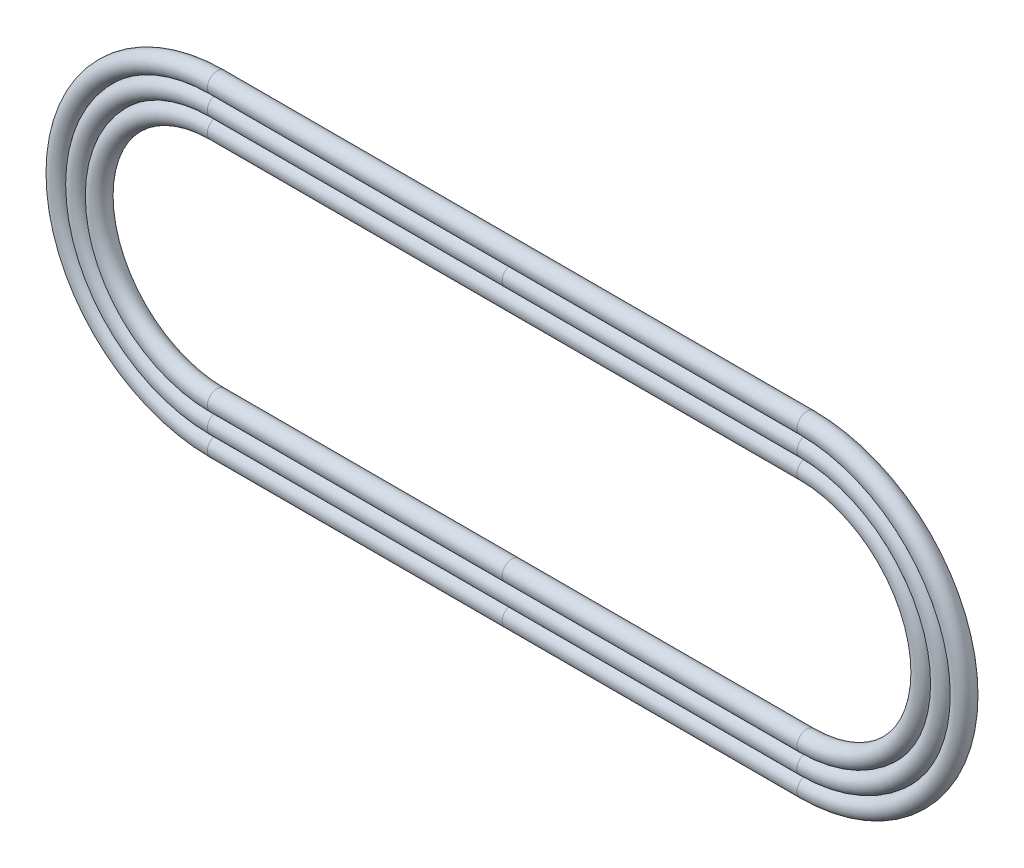
ISO-10303-21;
HEADER;
FILE_DESCRIPTION(('STEP AP214'),'2;1');
FILE_NAME('part.step','',(''),(''),'','','');
FILE_SCHEMA(('AUTOMOTIVE_DESIGN { 1 0 10303 214 1 1 1 1 }'));
ENDSEC;
DATA;
#1=APPLICATION_CONTEXT('core data for automotive mechanical design processes');
#2=APPLICATION_PROTOCOL_DEFINITION('international standard','automotive_design',2000,#1);
#3=PRODUCT_CONTEXT('',#1,'mechanical');
#4=PRODUCT('Part','Part','',(#3));
#5=PRODUCT_RELATED_PRODUCT_CATEGORY('part','',(#4));
#6=PRODUCT_DEFINITION_FORMATION('','',#4);
#7=PRODUCT_DEFINITION_CONTEXT('part definition',#1,'design');
#8=PRODUCT_DEFINITION('design','',#6,#7);
#9=PRODUCT_DEFINITION_SHAPE('','',#8);
#10=(LENGTH_UNIT() NAMED_UNIT(*) SI_UNIT(.MILLI.,.METRE.));
#11=(NAMED_UNIT(*) PLANE_ANGLE_UNIT() SI_UNIT($,.RADIAN.));
#12=(NAMED_UNIT(*) SI_UNIT($,.STERADIAN.) SOLID_ANGLE_UNIT());
#13=UNCERTAINTY_MEASURE_WITH_UNIT(LENGTH_MEASURE(1.E-05),#10,'distance_accuracy_value','');
#14=(GEOMETRIC_REPRESENTATION_CONTEXT(3) GLOBAL_UNCERTAINTY_ASSIGNED_CONTEXT((#13)) GLOBAL_UNIT_ASSIGNED_CONTEXT((#10,
#11,#12)) REPRESENTATION_CONTEXT('',''));
#15=CARTESIAN_POINT('',(0.,0.,0.));
#16=DIRECTION('',(0.,0.,1.));
#17=DIRECTION('',(1.,0.,0.));
#18=AXIS2_PLACEMENT_3D('',#15,#16,#17);
#19=CARTESIAN_POINT('',(0.,-600.,0.));
#20=DIRECTION('',(-1.,0.,0.));
#21=DIRECTION('',(0.,-1.,0.));
#22=AXIS2_PLACEMENT_3D('',#19,#20,#21);
#23=CYLINDRICAL_SURFACE('',#22,50.);
#24=CARTESIAN_POINT('',(-1500.,-600.,0.));
#25=DIRECTION('',(1.,0.,0.));
#26=DIRECTION('',(0.,0.,-1.));
#27=AXIS2_PLACEMENT_3D('',#24,#25,#26);
#28=CIRCLE('',#27,50.);
#29=CARTESIAN_POINT('',(-1500.,-650.,0.));
#30=VERTEX_POINT('',#29);
#31=EDGE_CURVE('E65',#30,#30,#28,.T.);
#32=ORIENTED_EDGE('',*,*,#31,.T.);
#33=EDGE_LOOP('',(#32));
#34=FACE_BOUND('',#33,.T.);
#35=CARTESIAN_POINT('',(0.,-600.,0.));
#36=DIRECTION('',(1.,0.,0.));
#37=DIRECTION('',(0.,0.,-1.));
#38=AXIS2_PLACEMENT_3D('',#35,#36,#37);
#39=CIRCLE('',#38,50.);
#40=CARTESIAN_POINT('',(0.,-600.,-50.));
#41=VERTEX_POINT('',#40);
#42=EDGE_CURVE('E70',#41,#41,#39,.T.);
#43=ORIENTED_EDGE('',*,*,#42,.F.);
#44=EDGE_LOOP('',(#43));
#45=FACE_BOUND('',#44,.T.);
#46=ADVANCED_FACE('F50',(#34,#45),#23,.T.);
#47=CARTESIAN_POINT('',(-1500.,0.,0.));
#48=DIRECTION('',(0.,0.,-1.));
#49=DIRECTION('',(-1.,0.,0.));
#50=AXIS2_PLACEMENT_3D('',#47,#48,#49);
#51=TOROIDAL_SURFACE('',#50,600.,50.);
#52=CARTESIAN_POINT('',(-1500.,600.,0.));
#53=DIRECTION('',(-1.,0.,0.));
#54=DIRECTION('',(0.,0.,-1.));
#55=AXIS2_PLACEMENT_3D('',#52,#53,#54);
#56=CIRCLE('',#55,50.);
#57=CARTESIAN_POINT('',(-1500.,650.,0.));
#58=VERTEX_POINT('',#57);
#59=EDGE_CURVE('E61',#58,#58,#56,.T.);
#60=CARTESIAN_POINT('',(-1500.,0.,0.));
#61=DIRECTION('',(0.,0.,-1.));
#62=DIRECTION('',(-1.,0.,0.));
#63=AXIS2_PLACEMENT_3D('',#60,#61,#62);
#64=CIRCLE('',#63,650.);
#65=EDGE_CURVE('',#30,#58,#64,.T.);
#66=ORIENTED_EDGE('',*,*,#31,.F.);
#67=ORIENTED_EDGE('',*,*,#59,.T.);
#68=ORIENTED_EDGE('',*,*,#65,.T.);
#69=ORIENTED_EDGE('',*,*,#65,.F.);
#70=EDGE_LOOP('',(#66,#68,#67,#69));
#71=FACE_BOUND('',#70,.T.);
#72=ADVANCED_FACE('F77',(#71),#51,.T.);
#73=CARTESIAN_POINT('',(-1500.,600.,0.));
#74=DIRECTION('',(1.,0.,0.));
#75=DIRECTION('',(0.,1.,0.));
#76=AXIS2_PLACEMENT_3D('',#73,#74,#75);
#77=CYLINDRICAL_SURFACE('',#76,50.);
#78=CARTESIAN_POINT('',(1500.,600.000000000001,0.));
#79=DIRECTION('',(-1.,0.,0.));
#80=DIRECTION('',(0.,0.,-1.));
#81=AXIS2_PLACEMENT_3D('',#78,#79,#80);
#82=CIRCLE('',#81,50.);
#83=CARTESIAN_POINT('',(1500.,650.000000000001,0.));
#84=VERTEX_POINT('',#83);
#85=EDGE_CURVE('E57',#84,#84,#82,.T.);
#86=ORIENTED_EDGE('',*,*,#85,.T.);
#87=EDGE_LOOP('',(#86));
#88=FACE_BOUND('',#87,.T.);
#89=ORIENTED_EDGE('',*,*,#59,.F.);
#90=EDGE_LOOP('',(#89));
#91=FACE_BOUND('',#90,.T.);
#92=ADVANCED_FACE('F83',(#88,#91),#77,.T.);
#93=CARTESIAN_POINT('',(1500.,5.55111512312578E-13,0.));
#94=DIRECTION('',(0.,0.,-1.));
#95=DIRECTION('',(-1.,0.,0.));
#96=AXIS2_PLACEMENT_3D('',#93,#94,#95);
#97=TOROIDAL_SURFACE('',#96,600.,50.);
#98=CARTESIAN_POINT('',(1500.,-600.,0.));
#99=DIRECTION('',(1.,0.,0.));
#100=DIRECTION('',(0.,0.,-1.));
#101=AXIS2_PLACEMENT_3D('',#98,#99,#100);
#102=CIRCLE('',#101,50.);
#103=CARTESIAN_POINT('',(1500.,-650.,0.));
#104=VERTEX_POINT('',#103);
#105=EDGE_CURVE('E11',#104,#104,#102,.T.);
#106=CARTESIAN_POINT('',(1500.,5.55111512312578E-13,0.));
#107=DIRECTION('',(0.,0.,-1.));
#108=DIRECTION('',(-1.,0.,0.));
#109=AXIS2_PLACEMENT_3D('',#106,#107,#108);
#110=CIRCLE('',#109,650.);
#111=EDGE_CURVE('',#84,#104,#110,.T.);
#112=ORIENTED_EDGE('',*,*,#85,.F.);
#113=ORIENTED_EDGE('',*,*,#105,.T.);
#114=ORIENTED_EDGE('',*,*,#111,.T.);
#115=ORIENTED_EDGE('',*,*,#111,.F.);
#116=EDGE_LOOP('',(#112,#114,#113,#115));
#117=FACE_BOUND('',#116,.T.);
#118=ADVANCED_FACE('F88',(#117),#97,.T.);
#119=CARTESIAN_POINT('',(1500.,-600.,0.));
#120=DIRECTION('',(-1.,0.,0.));
#121=DIRECTION('',(0.,-1.,0.));
#122=AXIS2_PLACEMENT_3D('',#119,#120,#121);
#123=CYLINDRICAL_SURFACE('',#122,50.);
#124=ORIENTED_EDGE('',*,*,#42,.T.);
#125=EDGE_LOOP('',(#124));
#126=FACE_BOUND('',#125,.T.);
#127=ORIENTED_EDGE('',*,*,#105,.F.);
#128=EDGE_LOOP('',(#127));
#129=FACE_BOUND('',#128,.T.);
#130=ADVANCED_FACE('F52',(#126,#129),#123,.T.);
#131=CLOSED_SHELL('',(#46,#72,#92,#118,#130));
#132=MANIFOLD_SOLID_BREP('B2',#131);
#133=CARTESIAN_POINT('',(0.,700.,0.));
#134=DIRECTION('',(-1.,0.,0.));
#135=DIRECTION('',(0.,-1.,0.));
#136=AXIS2_PLACEMENT_3D('',#133,#134,#135);
#137=CYLINDRICAL_SURFACE('',#136,50.);
#138=CARTESIAN_POINT('',(0.,700.,0.));
#139=DIRECTION('',(1.,0.,0.));
#140=DIRECTION('',(0.,0.,-1.));
#141=AXIS2_PLACEMENT_3D('',#138,#139,#140);
#142=CIRCLE('',#141,50.);
#143=CARTESIAN_POINT('',(0.,700.,-50.));
#144=VERTEX_POINT('',#143);
#145=EDGE_CURVE('E164',#144,#144,#142,.T.);
#146=ORIENTED_EDGE('',*,*,#145,.F.);
#147=EDGE_LOOP('',(#146));
#148=FACE_BOUND('',#147,.T.);
#149=CARTESIAN_POINT('',(-1500.,700.,0.));
#150=DIRECTION('',(1.,0.,0.));
#151=DIRECTION('',(0.,0.,-1.));
#152=AXIS2_PLACEMENT_3D('',#149,#150,#151);
#153=CIRCLE('',#152,50.);
#154=CARTESIAN_POINT('',(-1500.,750.,0.));
#155=VERTEX_POINT('',#154);
#156=EDGE_CURVE('E159',#155,#155,#153,.T.);
#157=ORIENTED_EDGE('',*,*,#156,.T.);
#158=EDGE_LOOP('',(#157));
#159=FACE_BOUND('',#158,.T.);
#160=ADVANCED_FACE('F144',(#148,#159),#137,.T.);
#161=CARTESIAN_POINT('',(-1500.,0.,0.));
#162=DIRECTION('',(0.,0.,1.));
#163=DIRECTION('',(1.,0.,0.));
#164=AXIS2_PLACEMENT_3D('',#161,#162,#163);
#165=TOROIDAL_SURFACE('',#164,700.,50.);
#166=CARTESIAN_POINT('',(-1500.,-700.,0.));
#167=DIRECTION('',(-1.,0.,0.));
#168=DIRECTION('',(0.,0.,-1.));
#169=AXIS2_PLACEMENT_3D('',#166,#167,#168);
#170=CIRCLE('',#169,50.);
#171=CARTESIAN_POINT('',(-1500.,-750.,0.));
#172=VERTEX_POINT('',#171);
#173=EDGE_CURVE('E155',#172,#172,#170,.T.);
#174=CARTESIAN_POINT('',(-1500.,0.,0.));
#175=DIRECTION('',(0.,0.,1.));
#176=DIRECTION('',(1.,0.,0.));
#177=AXIS2_PLACEMENT_3D('',#174,#175,#176);
#178=CIRCLE('',#177,750.);
#179=EDGE_CURVE('',#155,#172,#178,.T.);
#180=ORIENTED_EDGE('',*,*,#156,.F.);
#181=ORIENTED_EDGE('',*,*,#173,.T.);
#182=ORIENTED_EDGE('',*,*,#179,.T.);
#183=ORIENTED_EDGE('',*,*,#179,.F.);
#184=EDGE_LOOP('',(#180,#182,#181,#183));
#185=FACE_BOUND('',#184,.T.);
#186=ADVANCED_FACE('F171',(#185),#165,.T.);
#187=CARTESIAN_POINT('',(-1500.,-700.,0.));
#188=DIRECTION('',(1.,0.,0.));
#189=DIRECTION('',(0.,1.,0.));
#190=AXIS2_PLACEMENT_3D('',#187,#188,#189);
#191=CYLINDRICAL_SURFACE('',#190,50.);
#192=ORIENTED_EDGE('',*,*,#173,.F.);
#193=EDGE_LOOP('',(#192));
#194=FACE_BOUND('',#193,.T.);
#195=CARTESIAN_POINT('',(1500.,-700.,0.));
#196=DIRECTION('',(-1.,0.,0.));
#197=DIRECTION('',(0.,0.,-1.));
#198=AXIS2_PLACEMENT_3D('',#195,#196,#197);
#199=CIRCLE('',#198,50.);
#200=CARTESIAN_POINT('',(1500.,-750.,0.));
#201=VERTEX_POINT('',#200);
#202=EDGE_CURVE('E151',#201,#201,#199,.T.);
#203=ORIENTED_EDGE('',*,*,#202,.T.);
#204=EDGE_LOOP('',(#203));
#205=FACE_BOUND('',#204,.T.);
#206=ADVANCED_FACE('F176',(#194,#205),#191,.T.);
#207=CARTESIAN_POINT('',(1500.,5.55111512312578E-13,0.));
#208=DIRECTION('',(0.,0.,1.));
#209=DIRECTION('',(1.,0.,0.));
#210=AXIS2_PLACEMENT_3D('',#207,#208,#209);
#211=TOROIDAL_SURFACE('',#210,700.,50.);
#212=CARTESIAN_POINT('',(1500.,700.000000000001,0.));
#213=DIRECTION('',(1.,0.,0.));
#214=DIRECTION('',(0.,0.,-1.));
#215=AXIS2_PLACEMENT_3D('',#212,#213,#214);
#216=CIRCLE('',#215,50.);
#217=CARTESIAN_POINT('',(1500.,750.000000000001,0.));
#218=VERTEX_POINT('',#217);
#219=EDGE_CURVE('E49',#218,#218,#216,.T.);
#220=CARTESIAN_POINT('',(1500.,5.55111512312578E-13,0.));
#221=DIRECTION('',(0.,0.,1.));
#222=DIRECTION('',(1.,0.,0.));
#223=AXIS2_PLACEMENT_3D('',#220,#221,#222);
#224=CIRCLE('',#223,750.);
#225=EDGE_CURVE('',#201,#218,#224,.T.);
#226=ORIENTED_EDGE('',*,*,#202,.F.);
#227=ORIENTED_EDGE('',*,*,#219,.T.);
#228=ORIENTED_EDGE('',*,*,#225,.T.);
#229=ORIENTED_EDGE('',*,*,#225,.F.);
#230=EDGE_LOOP('',(#226,#228,#227,#229));
#231=FACE_BOUND('',#230,.T.);
#232=ADVANCED_FACE('F182',(#231),#211,.T.);
#233=CARTESIAN_POINT('',(1500.,700.000000000001,0.));
#234=DIRECTION('',(-1.,0.,0.));
#235=DIRECTION('',(0.,-1.,0.));
#236=AXIS2_PLACEMENT_3D('',#233,#234,#235);
#237=CYLINDRICAL_SURFACE('',#236,50.);
#238=ORIENTED_EDGE('',*,*,#219,.F.);
#239=EDGE_LOOP('',(#238));
#240=FACE_BOUND('',#239,.T.);
#241=ORIENTED_EDGE('',*,*,#145,.T.);
#242=EDGE_LOOP('',(#241));
#243=FACE_BOUND('',#242,.T.);
#244=ADVANCED_FACE('F146',(#240,#243),#237,.T.);
#245=CLOSED_SHELL('',(#160,#186,#206,#232,#244));
#246=MANIFOLD_SOLID_BREP('B6',#245);
#247=CARTESIAN_POINT('',(0.,-800.,0.));
#248=DIRECTION('',(-1.,0.,0.));
#249=DIRECTION('',(0.,-1.,0.));
#250=AXIS2_PLACEMENT_3D('',#247,#248,#249);
#251=CYLINDRICAL_SURFACE('',#250,50.);
#252=CARTESIAN_POINT('',(0.,-800.,0.));
#253=DIRECTION('',(1.,0.,0.));
#254=DIRECTION('',(0.,0.,-1.));
#255=AXIS2_PLACEMENT_3D('',#252,#253,#254);
#256=CIRCLE('',#255,50.);
#257=CARTESIAN_POINT('',(0.,-800.,-50.));
#258=VERTEX_POINT('',#257);
#259=EDGE_CURVE('E245',#258,#258,#256,.T.);
#260=ORIENTED_EDGE('',*,*,#259,.F.);
#261=EDGE_LOOP('',(#260));
#262=FACE_BOUND('',#261,.T.);
#263=CARTESIAN_POINT('',(-1500.,-800.,0.));
#264=DIRECTION('',(1.,0.,0.));
#265=DIRECTION('',(0.,0.,-1.));
#266=AXIS2_PLACEMENT_3D('',#263,#264,#265);
#267=CIRCLE('',#266,50.);
#268=CARTESIAN_POINT('',(-1500.,-850.,0.));
#269=VERTEX_POINT('',#268);
#270=EDGE_CURVE('E239',#269,#269,#267,.T.);
#271=ORIENTED_EDGE('',*,*,#270,.T.);
#272=EDGE_LOOP('',(#271));
#273=FACE_BOUND('',#272,.T.);
#274=ADVANCED_FACE('F221',(#262,#273),#251,.T.);
#275=CARTESIAN_POINT('',(-1500.,0.,0.));
#276=DIRECTION('',(0.,0.,-1.));
#277=DIRECTION('',(-1.,0.,0.));
#278=AXIS2_PLACEMENT_3D('',#275,#276,#277);
#279=TOROIDAL_SURFACE('',#278,800.,50.);
#280=CARTESIAN_POINT('',(-1500.,800.,0.));
#281=DIRECTION('',(-1.,0.,0.));
#282=DIRECTION('',(0.,0.,-1.));
#283=AXIS2_PLACEMENT_3D('',#280,#281,#282);
#284=CIRCLE('',#283,50.);
#285=CARTESIAN_POINT('',(-1500.,850.,0.));
#286=VERTEX_POINT('',#285);
#287=EDGE_CURVE('E234',#286,#286,#284,.T.);
#288=CARTESIAN_POINT('',(-1500.,0.,0.));
#289=DIRECTION('',(0.,0.,-1.));
#290=DIRECTION('',(-1.,0.,0.));
#291=AXIS2_PLACEMENT_3D('',#288,#289,#290);
#292=CIRCLE('',#291,850.);
#293=EDGE_CURVE('',#269,#286,#292,.T.);
#294=ORIENTED_EDGE('',*,*,#270,.F.);
#295=ORIENTED_EDGE('',*,*,#287,.T.);
#296=ORIENTED_EDGE('',*,*,#293,.T.);
#297=ORIENTED_EDGE('',*,*,#293,.F.);
#298=EDGE_LOOP('',(#294,#296,#295,#297));
#299=FACE_BOUND('',#298,.T.);
#300=ADVANCED_FACE('F253',(#299),#279,.T.);
#301=CARTESIAN_POINT('',(-1500.,800.,0.));
#302=DIRECTION('',(1.,0.,0.));
#303=DIRECTION('',(0.,1.,0.));
#304=AXIS2_PLACEMENT_3D('',#301,#302,#303);
#305=CYLINDRICAL_SURFACE('',#304,50.);
#306=ORIENTED_EDGE('',*,*,#287,.F.);
#307=EDGE_LOOP('',(#306));
#308=FACE_BOUND('',#307,.T.);
#309=CARTESIAN_POINT('',(1500.,800.000000000001,0.));
#310=DIRECTION('',(-1.,0.,0.));
#311=DIRECTION('',(0.,0.,-1.));
#312=AXIS2_PLACEMENT_3D('',#309,#310,#311);
#313=CIRCLE('',#312,50.);
#314=CARTESIAN_POINT('',(1500.,850.000000000001,0.));
#315=VERTEX_POINT('',#314);
#316=EDGE_CURVE('E229',#315,#315,#313,.T.);
#317=ORIENTED_EDGE('',*,*,#316,.T.);
#318=EDGE_LOOP('',(#317));
#319=FACE_BOUND('',#318,.T.);
#320=ADVANCED_FACE('F258',(#308,#319),#305,.T.);
#321=CARTESIAN_POINT('',(1500.,5.55111512312578E-13,0.));
#322=DIRECTION('',(0.,0.,-1.));
#323=DIRECTION('',(-1.,0.,0.));
#324=AXIS2_PLACEMENT_3D('',#321,#322,#323);
#325=TOROIDAL_SURFACE('',#324,800.,50.);
#326=CARTESIAN_POINT('',(1500.,-800.,0.));
#327=DIRECTION('',(1.,0.,0.));
#328=DIRECTION('',(0.,0.,-1.));
#329=AXIS2_PLACEMENT_3D('',#326,#327,#328);
#330=CIRCLE('',#329,50.);
#331=CARTESIAN_POINT('',(1500.,-850.,0.));
#332=VERTEX_POINT('',#331);
#333=EDGE_CURVE('E143',#332,#332,#330,.T.);
#334=CARTESIAN_POINT('',(1500.,5.55111512312578E-13,0.));
#335=DIRECTION('',(0.,0.,-1.));
#336=DIRECTION('',(-1.,0.,0.));
#337=AXIS2_PLACEMENT_3D('',#334,#335,#336);
#338=CIRCLE('',#337,850.);
#339=EDGE_CURVE('',#315,#332,#338,.T.);
#340=ORIENTED_EDGE('',*,*,#316,.F.);
#341=ORIENTED_EDGE('',*,*,#333,.T.);
#342=ORIENTED_EDGE('',*,*,#339,.T.);
#343=ORIENTED_EDGE('',*,*,#339,.F.);
#344=EDGE_LOOP('',(#340,#342,#341,#343));
#345=FACE_BOUND('',#344,.T.);
#346=ADVANCED_FACE('F264',(#345),#325,.T.);
#347=CARTESIAN_POINT('',(1500.,-800.,0.));
#348=DIRECTION('',(-1.,0.,0.));
#349=DIRECTION('',(0.,-1.,0.));
#350=AXIS2_PLACEMENT_3D('',#347,#348,#349);
#351=CYLINDRICAL_SURFACE('',#350,50.);
#352=ORIENTED_EDGE('',*,*,#333,.F.);
#353=EDGE_LOOP('',(#352));
#354=FACE_BOUND('',#353,.T.);
#355=ORIENTED_EDGE('',*,*,#259,.T.);
#356=EDGE_LOOP('',(#355));
#357=FACE_BOUND('',#356,.T.);
#358=ADVANCED_FACE('F223',(#354,#357),#351,.T.);
#359=CLOSED_SHELL('',(#274,#300,#320,#346,#358));
#360=MANIFOLD_SOLID_BREP('B44',#359);
#361=ADVANCED_BREP_SHAPE_REPRESENTATION('',(#18,#132,#246,#360),#14);
#362=SHAPE_DEFINITION_REPRESENTATION(#9,#361);
ENDSEC;
END-ISO-10303-21;
